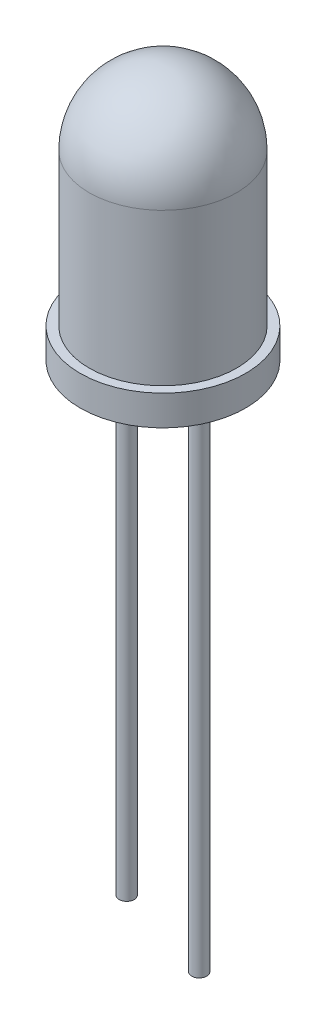
ISO-10303-21;
HEADER;
FILE_DESCRIPTION(('STEP AP214'),'2;1');
FILE_NAME('part.step','',(''),(''),'','','');
FILE_SCHEMA(('AUTOMOTIVE_DESIGN { 1 0 10303 214 1 1 1 1 }'));
ENDSEC;
DATA;
#1=APPLICATION_CONTEXT('core data for automotive mechanical design processes');
#2=APPLICATION_PROTOCOL_DEFINITION('international standard','automotive_design',2000,#1);
#3=PRODUCT_CONTEXT('',#1,'mechanical');
#4=PRODUCT('Part','Part','',(#3));
#5=PRODUCT_RELATED_PRODUCT_CATEGORY('part','',(#4));
#6=PRODUCT_DEFINITION_FORMATION('','',#4);
#7=PRODUCT_DEFINITION_CONTEXT('part definition',#1,'design');
#8=PRODUCT_DEFINITION('design','',#6,#7);
#9=PRODUCT_DEFINITION_SHAPE('','',#8);
#10=(LENGTH_UNIT() NAMED_UNIT(*) SI_UNIT(.MILLI.,.METRE.));
#11=(NAMED_UNIT(*) PLANE_ANGLE_UNIT() SI_UNIT($,.RADIAN.));
#12=(NAMED_UNIT(*) SI_UNIT($,.STERADIAN.) SOLID_ANGLE_UNIT());
#13=UNCERTAINTY_MEASURE_WITH_UNIT(LENGTH_MEASURE(1.E-05),#10,'distance_accuracy_value','');
#14=(GEOMETRIC_REPRESENTATION_CONTEXT(3) GLOBAL_UNCERTAINTY_ASSIGNED_CONTEXT((#13)) GLOBAL_UNIT_ASSIGNED_CONTEXT((#10,
#11,#12)) REPRESENTATION_CONTEXT('',''));
#15=CARTESIAN_POINT('',(0.,0.,0.));
#16=DIRECTION('',(0.,0.,1.));
#17=DIRECTION('',(1.,0.,0.));
#18=AXIS2_PLACEMENT_3D('',#15,#16,#17);
#19=CARTESIAN_POINT('',(0.,1.,0.));
#20=DIRECTION('',(0.,-1.,0.));
#21=DIRECTION('',(0.,0.,-1.));
#22=AXIS2_PLACEMENT_3D('',#19,#20,#21);
#23=CYLINDRICAL_SURFACE('',#22,2.75);
#24=CARTESIAN_POINT('',(0.,1.,0.));
#25=DIRECTION('',(0.,1.,0.));
#26=DIRECTION('',(0.,0.,1.));
#27=AXIS2_PLACEMENT_3D('',#24,#25,#26);
#28=CIRCLE('',#27,2.75);
#29=CARTESIAN_POINT('',(0.,1.,2.75));
#30=VERTEX_POINT('',#29);
#31=EDGE_CURVE('E49',#30,#30,#28,.T.);
#32=ORIENTED_EDGE('',*,*,#31,.F.);
#33=EDGE_LOOP('',(#32));
#34=FACE_BOUND('',#33,.T.);
#35=CARTESIAN_POINT('',(0.,0.,0.));
#36=DIRECTION('',(0.,1.,0.));
#37=DIRECTION('',(0.,0.,1.));
#38=AXIS2_PLACEMENT_3D('',#35,#36,#37);
#39=CIRCLE('',#38,2.75);
#40=CARTESIAN_POINT('',(0.,0.,2.75));
#41=VERTEX_POINT('',#40);
#42=EDGE_CURVE('E55',#41,#41,#39,.T.);
#43=ORIENTED_EDGE('',*,*,#42,.T.);
#44=EDGE_LOOP('',(#43));
#45=FACE_BOUND('',#44,.T.);
#46=ADVANCED_FACE('F34',(#34,#45),#23,.T.);
#47=CARTESIAN_POINT('',(0.,1.,0.));
#48=DIRECTION('',(0.,1.,0.));
#49=DIRECTION('',(0.,0.,1.));
#50=AXIS2_PLACEMENT_3D('',#47,#48,#49);
#51=PLANE('',#50);
#52=CARTESIAN_POINT('',(0.,1.,0.));
#53=DIRECTION('',(0.,1.,0.));
#54=DIRECTION('',(0.,0.,1.));
#55=AXIS2_PLACEMENT_3D('',#52,#53,#54);
#56=CIRCLE('',#55,2.45);
#57=CARTESIAN_POINT('',(0.,1.,2.45));
#58=VERTEX_POINT('',#57);
#59=EDGE_CURVE('E45',#58,#58,#56,.T.);
#60=ORIENTED_EDGE('',*,*,#59,.F.);
#61=EDGE_LOOP('',(#60));
#62=FACE_BOUND('',#61,.T.);
#63=ORIENTED_EDGE('',*,*,#31,.T.);
#64=EDGE_LOOP('',(#63));
#65=FACE_BOUND('',#64,.T.);
#66=ADVANCED_FACE('F82',(#62,#65),#51,.T.);
#67=CARTESIAN_POINT('',(0.,0.,0.));
#68=DIRECTION('',(0.,1.,0.));
#69=DIRECTION('',(0.,0.,1.));
#70=AXIS2_PLACEMENT_3D('',#67,#68,#69);
#71=PLANE('',#70);
#72=CARTESIAN_POINT('',(1.20516202768511,0.,0.));
#73=DIRECTION('',(0.,1.,0.));
#74=DIRECTION('',(0.,0.,1.));
#75=AXIS2_PLACEMENT_3D('',#72,#73,#74);
#76=CIRCLE('',#75,0.25);
#77=CARTESIAN_POINT('',(1.20516202768511,0.,0.25));
#78=VERTEX_POINT('',#77);
#79=EDGE_CURVE('E10',#78,#78,#76,.F.);
#80=ORIENTED_EDGE('',*,*,#79,.F.);
#81=EDGE_LOOP('',(#80));
#82=FACE_BOUND('',#81,.T.);
#83=CARTESIAN_POINT('',(-1.20516202768511,0.,0.));
#84=DIRECTION('',(0.,1.,0.));
#85=DIRECTION('',(0.,0.,1.));
#86=AXIS2_PLACEMENT_3D('',#83,#84,#85);
#87=CIRCLE('',#86,0.25);
#88=CARTESIAN_POINT('',(-1.20516202768511,0.,0.25));
#89=VERTEX_POINT('',#88);
#90=EDGE_CURVE('E41',#89,#89,#87,.F.);
#91=ORIENTED_EDGE('',*,*,#90,.F.);
#92=EDGE_LOOP('',(#91));
#93=FACE_BOUND('',#92,.T.);
#94=ORIENTED_EDGE('',*,*,#42,.F.);
#95=EDGE_LOOP('',(#94));
#96=FACE_BOUND('',#95,.T.);
#97=ADVANCED_FACE('F87',(#82,#93,#96),#71,.F.);
#98=CARTESIAN_POINT('',(0.,6.05,0.));
#99=DIRECTION('',(0.,-1.,0.));
#100=DIRECTION('',(0.,0.,-1.));
#101=AXIS2_PLACEMENT_3D('',#98,#99,#100);
#102=CYLINDRICAL_SURFACE('',#101,2.45);
#103=CARTESIAN_POINT('',(0.,6.05,0.));
#104=DIRECTION('',(0.,1.,0.));
#105=DIRECTION('',(0.,0.,1.));
#106=AXIS2_PLACEMENT_3D('',#103,#104,#105);
#107=CIRCLE('',#106,2.45);
#108=CARTESIAN_POINT('',(0.,6.05,2.45));
#109=VERTEX_POINT('',#108);
#110=EDGE_CURVE('E52',#109,#109,#107,.T.);
#111=ORIENTED_EDGE('',*,*,#110,.F.);
#112=EDGE_LOOP('',(#111));
#113=FACE_BOUND('',#112,.T.);
#114=ORIENTED_EDGE('',*,*,#59,.T.);
#115=EDGE_LOOP('',(#114));
#116=FACE_BOUND('',#115,.T.);
#117=ADVANCED_FACE('F94',(#113,#116),#102,.T.);
#118=CARTESIAN_POINT('',(0.,6.05,0.));
#119=DIRECTION('',(0.,0.,1.));
#120=DIRECTION('',(1.,0.,0.));
#121=AXIS2_PLACEMENT_3D('',#118,#119,#120);
#122=SPHERICAL_SURFACE('',#121,2.45);
#123=CARTESIAN_POINT('',(0.,6.05,0.));
#124=DIRECTION('',(0.,1.,0.));
#125=DIRECTION('',(0.,0.,1.));
#126=AXIS2_PLACEMENT_3D('',#123,#124,#125);
#127=SPHERICAL_SURFACE('',#126,2.45);
#128=ORIENTED_EDGE('',*,*,#110,.T.);
#129=EDGE_LOOP('',(#128));
#130=FACE_BOUND('',#129,.T.);
#131=ADVANCED_FACE('F36',(#130),#127,.T.);
#132=CARTESIAN_POINT('',(-1.20516202768511,-16.,0.));
#133=DIRECTION('',(0.,1.,0.));
#134=DIRECTION('',(0.,0.,1.));
#135=AXIS2_PLACEMENT_3D('',#132,#133,#134);
#136=CYLINDRICAL_SURFACE('',#135,0.25);
#137=CARTESIAN_POINT('',(-1.20516202768511,-16.,0.));
#138=DIRECTION('',(0.,-1.,0.));
#139=DIRECTION('',(0.,0.,-1.));
#140=AXIS2_PLACEMENT_3D('',#137,#138,#139);
#141=CIRCLE('',#140,0.25);
#142=CARTESIAN_POINT('',(-1.20516202768511,-16.,-0.25));
#143=VERTEX_POINT('',#142);
#144=EDGE_CURVE('E56',#143,#143,#141,.T.);
#145=ORIENTED_EDGE('',*,*,#144,.F.);
#146=EDGE_LOOP('',(#145));
#147=FACE_BOUND('',#146,.T.);
#148=ORIENTED_EDGE('',*,*,#90,.T.);
#149=EDGE_LOOP('',(#148));
#150=FACE_BOUND('',#149,.T.);
#151=ADVANCED_FACE('F78',(#147,#150),#136,.T.);
#152=CARTESIAN_POINT('',(-1.20516202768511,-16.,0.));
#153=DIRECTION('',(0.,-1.,0.));
#154=DIRECTION('',(0.,0.,-1.));
#155=AXIS2_PLACEMENT_3D('',#152,#153,#154);
#156=PLANE('',#155);
#157=ORIENTED_EDGE('',*,*,#144,.T.);
#158=EDGE_LOOP('',(#157));
#159=FACE_BOUND('',#158,.T.);
#160=ADVANCED_FACE('F71',(#159),#156,.T.);
#161=CARTESIAN_POINT('',(1.20516202768511,-17.,0.));
#162=DIRECTION('',(0.,1.,0.));
#163=DIRECTION('',(0.,0.,1.));
#164=AXIS2_PLACEMENT_3D('',#161,#162,#163);
#165=CYLINDRICAL_SURFACE('',#164,0.25);
#166=CARTESIAN_POINT('',(1.20516202768511,-17.,0.));
#167=DIRECTION('',(0.,-1.,0.));
#168=DIRECTION('',(0.,0.,-1.));
#169=AXIS2_PLACEMENT_3D('',#166,#167,#168);
#170=CIRCLE('',#169,0.25);
#171=CARTESIAN_POINT('',(1.20516202768511,-17.,-0.25));
#172=VERTEX_POINT('',#171);
#173=EDGE_CURVE('E63',#172,#172,#170,.T.);
#174=ORIENTED_EDGE('',*,*,#173,.F.);
#175=EDGE_LOOP('',(#174));
#176=FACE_BOUND('',#175,.T.);
#177=ORIENTED_EDGE('',*,*,#79,.T.);
#178=EDGE_LOOP('',(#177));
#179=FACE_BOUND('',#178,.T.);
#180=ADVANCED_FACE('F69',(#176,#179),#165,.T.);
#181=CARTESIAN_POINT('',(1.20516202768511,-17.,0.));
#182=DIRECTION('',(0.,-1.,0.));
#183=DIRECTION('',(0.,0.,-1.));
#184=AXIS2_PLACEMENT_3D('',#181,#182,#183);
#185=PLANE('',#184);
#186=ORIENTED_EDGE('',*,*,#173,.T.);
#187=EDGE_LOOP('',(#186));
#188=FACE_BOUND('',#187,.T.);
#189=ADVANCED_FACE('F67',(#188),#185,.T.);
#190=CLOSED_SHELL('',(#46,#66,#97,#117,#131,#151,#160,#180,#189));
#191=MANIFOLD_SOLID_BREP('B2',#190);
#192=ADVANCED_BREP_SHAPE_REPRESENTATION('',(#18,#191),#14);
#193=SHAPE_DEFINITION_REPRESENTATION(#9,#192);
ENDSEC;
END-ISO-10303-21;
